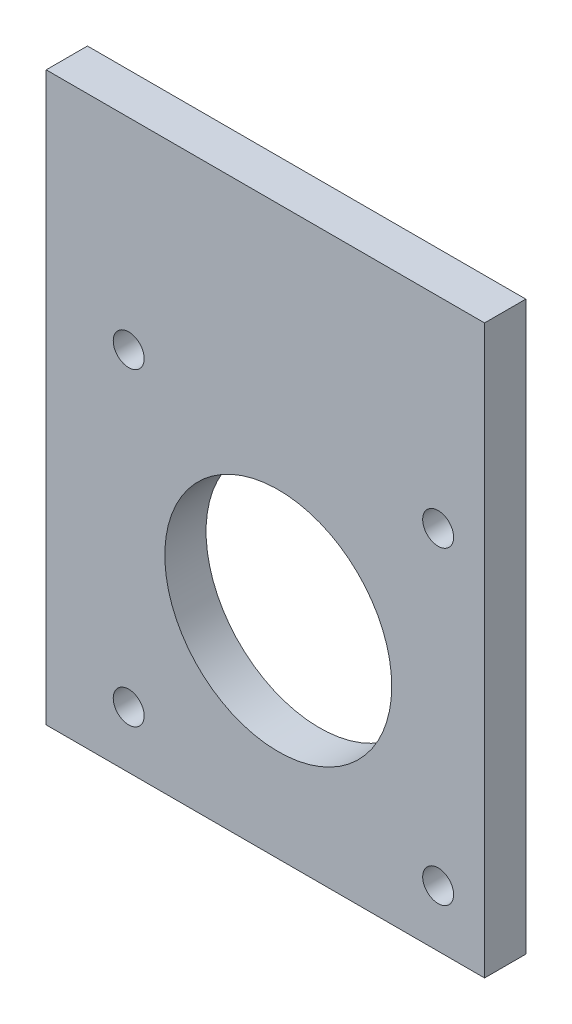
ISO-10303-21;
HEADER;
FILE_DESCRIPTION(('STEP AP214'),'2;1');
FILE_NAME('part.step','',(''),(''),'','','');
FILE_SCHEMA(('AUTOMOTIVE_DESIGN { 1 0 10303 214 1 1 1 1 }'));
ENDSEC;
DATA;
#1=APPLICATION_CONTEXT('core data for automotive mechanical design processes');
#2=APPLICATION_PROTOCOL_DEFINITION('international standard','automotive_design',2000,#1);
#3=PRODUCT_CONTEXT('',#1,'mechanical');
#4=PRODUCT('Part','Part','',(#3));
#5=PRODUCT_RELATED_PRODUCT_CATEGORY('part','',(#4));
#6=PRODUCT_DEFINITION_FORMATION('','',#4);
#7=PRODUCT_DEFINITION_CONTEXT('part definition',#1,'design');
#8=PRODUCT_DEFINITION('design','',#6,#7);
#9=PRODUCT_DEFINITION_SHAPE('','',#8);
#10=(LENGTH_UNIT() NAMED_UNIT(*) SI_UNIT(.MILLI.,.METRE.));
#11=(NAMED_UNIT(*) PLANE_ANGLE_UNIT() SI_UNIT($,.RADIAN.));
#12=(NAMED_UNIT(*) SI_UNIT($,.STERADIAN.) SOLID_ANGLE_UNIT());
#13=UNCERTAINTY_MEASURE_WITH_UNIT(LENGTH_MEASURE(1.E-05),#10,'distance_accuracy_value','');
#14=(GEOMETRIC_REPRESENTATION_CONTEXT(3) GLOBAL_UNCERTAINTY_ASSIGNED_CONTEXT((#13)) GLOBAL_UNIT_ASSIGNED_CONTEXT((#10,
#11,#12)) REPRESENTATION_CONTEXT('',''));
#15=CARTESIAN_POINT('',(0.,0.,0.));
#16=DIRECTION('',(0.,0.,1.));
#17=DIRECTION('',(1.,0.,0.));
#18=AXIS2_PLACEMENT_3D('',#15,#16,#17);
#19=CARTESIAN_POINT('',(21.25,20.,2.));
#20=DIRECTION('',(-1.,0.,0.));
#21=DIRECTION('',(0.,0.,1.));
#22=AXIS2_PLACEMENT_3D('',#19,#20,#21);
#23=PLANE('',#22);
#24=DIRECTION('',(0.,1.,0.));
#25=VECTOR('',#24,1.);
#26=CARTESIAN_POINT('',(21.25,20.,-2.));
#27=LINE('',#26,#25);
#28=CARTESIAN_POINT('',(21.25,-20.,-2.));
#29=VERTEX_POINT('',#28);
#30=CARTESIAN_POINT('',(21.25,35.,-2.));
#31=VERTEX_POINT('',#30);
#32=EDGE_CURVE('E130',#29,#31,#27,.T.);
#33=ORIENTED_EDGE('',*,*,#32,.T.);
#34=DIRECTION('',(0.,0.,-1.));
#35=VECTOR('',#34,1.);
#36=CARTESIAN_POINT('',(21.25,35.,-2.));
#37=LINE('',#36,#35);
#38=CARTESIAN_POINT('',(21.25,35.,2.));
#39=VERTEX_POINT('',#38);
#40=EDGE_CURVE('E94',#39,#31,#37,.T.);
#41=ORIENTED_EDGE('',*,*,#40,.F.);
#42=DIRECTION('',(0.,1.,0.));
#43=VECTOR('',#42,1.);
#44=CARTESIAN_POINT('',(21.25,20.,2.));
#45=LINE('',#44,#43);
#46=CARTESIAN_POINT('',(21.25,-20.,2.));
#47=VERTEX_POINT('',#46);
#48=EDGE_CURVE('E85',#47,#39,#45,.T.);
#49=ORIENTED_EDGE('',*,*,#48,.F.);
#50=DIRECTION('',(0.,0.,-1.));
#51=VECTOR('',#50,1.);
#52=CARTESIAN_POINT('',(21.25,-20.,2.));
#53=LINE('',#52,#51);
#54=EDGE_CURVE('E47',#47,#29,#53,.T.);
#55=ORIENTED_EDGE('',*,*,#54,.T.);
#56=EDGE_LOOP('',(#33,#41,#49,#55));
#57=FACE_BOUND('',#56,.T.);
#58=ADVANCED_FACE('F39',(#57),#23,.F.);
#59=CARTESIAN_POINT('',(-21.25,20.,2.));
#60=DIRECTION('',(1.,0.,0.));
#61=DIRECTION('',(0.,1.,0.));
#62=AXIS2_PLACEMENT_3D('',#59,#60,#61);
#63=PLANE('',#62);
#64=DIRECTION('',(0.,-1.,0.));
#65=VECTOR('',#64,1.);
#66=CARTESIAN_POINT('',(-21.25,20.,-2.));
#67=LINE('',#66,#65);
#68=CARTESIAN_POINT('',(-21.25,35.,-2.));
#69=VERTEX_POINT('',#68);
#70=CARTESIAN_POINT('',(-21.25,-20.,-2.));
#71=VERTEX_POINT('',#70);
#72=EDGE_CURVE('E66',#69,#71,#67,.T.);
#73=ORIENTED_EDGE('',*,*,#72,.T.);
#74=DIRECTION('',(0.,0.,-1.));
#75=VECTOR('',#74,1.);
#76=CARTESIAN_POINT('',(-21.25,-20.,2.));
#77=LINE('',#76,#75);
#78=CARTESIAN_POINT('',(-21.25,-20.,2.));
#79=VERTEX_POINT('',#78);
#80=EDGE_CURVE('E11',#79,#71,#77,.T.);
#81=ORIENTED_EDGE('',*,*,#80,.F.);
#82=DIRECTION('',(0.,-1.,0.));
#83=VECTOR('',#82,1.);
#84=CARTESIAN_POINT('',(-21.25,20.,2.));
#85=LINE('',#84,#83);
#86=CARTESIAN_POINT('',(-21.25,35.,2.));
#87=VERTEX_POINT('',#86);
#88=EDGE_CURVE('E80',#87,#79,#85,.T.);
#89=ORIENTED_EDGE('',*,*,#88,.F.);
#90=DIRECTION('',(0.,0.,1.));
#91=VECTOR('',#90,1.);
#92=CARTESIAN_POINT('',(-21.25,35.,-2.));
#93=LINE('',#92,#91);
#94=EDGE_CURVE('E84',#69,#87,#93,.T.);
#95=ORIENTED_EDGE('',*,*,#94,.F.);
#96=EDGE_LOOP('',(#73,#81,#89,#95));
#97=FACE_BOUND('',#96,.T.);
#98=ADVANCED_FACE('F82',(#97),#63,.F.);
#99=CARTESIAN_POINT('',(-21.25,-20.,2.));
#100=DIRECTION('',(0.,1.,0.));
#101=DIRECTION('',(0.,0.,1.));
#102=AXIS2_PLACEMENT_3D('',#99,#100,#101);
#103=PLANE('',#102);
#104=DIRECTION('',(1.,0.,0.));
#105=VECTOR('',#104,1.);
#106=CARTESIAN_POINT('',(-21.25,-20.,-2.));
#107=LINE('',#106,#105);
#108=EDGE_CURVE('E133',#71,#29,#107,.T.);
#109=ORIENTED_EDGE('',*,*,#108,.T.);
#110=ORIENTED_EDGE('',*,*,#54,.F.);
#111=DIRECTION('',(1.,0.,0.));
#112=VECTOR('',#111,1.);
#113=CARTESIAN_POINT('',(-21.25,-20.,2.));
#114=LINE('',#113,#112);
#115=EDGE_CURVE('E55',#79,#47,#114,.T.);
#116=ORIENTED_EDGE('',*,*,#115,.F.);
#117=ORIENTED_EDGE('',*,*,#80,.T.);
#118=EDGE_LOOP('',(#109,#110,#116,#117));
#119=FACE_BOUND('',#118,.T.);
#120=ADVANCED_FACE('F143',(#119),#103,.F.);
#121=CARTESIAN_POINT('',(0.,0.,2.));
#122=DIRECTION('',(0.,0.,1.));
#123=DIRECTION('',(1.,0.,0.));
#124=AXIS2_PLACEMENT_3D('',#121,#122,#123);
#125=PLANE('',#124);
#126=CARTESIAN_POINT('',(1.24999999999999,0.,2.));
#127=DIRECTION('',(0.,0.,1.));
#128=DIRECTION('',(1.,0.,0.));
#129=AXIS2_PLACEMENT_3D('',#126,#127,#128);
#130=CIRCLE('',#129,11.);
#131=CARTESIAN_POINT('',(12.25,0.,2.));
#132=VERTEX_POINT('',#131);
#133=EDGE_CURVE('E102',#132,#132,#130,.T.);
#134=ORIENTED_EDGE('',*,*,#133,.F.);
#135=EDGE_LOOP('',(#134));
#136=FACE_BOUND('',#135,.T.);
#137=CARTESIAN_POINT('',(16.7500000000003,-14.5,2.));
#138=DIRECTION('',(0.,0.,-1.));
#139=DIRECTION('',(-1.,0.,0.));
#140=AXIS2_PLACEMENT_3D('',#137,#138,#139);
#141=CIRCLE('',#140,1.49999999999999);
#142=CARTESIAN_POINT('',(15.2500000000003,-14.5,2.));
#143=VERTEX_POINT('',#142);
#144=EDGE_CURVE('E122',#143,#143,#141,.T.);
#145=ORIENTED_EDGE('',*,*,#144,.T.);
#146=EDGE_LOOP('',(#145));
#147=FACE_BOUND('',#146,.T.);
#148=CARTESIAN_POINT('',(-13.2499999999997,-14.5,2.));
#149=DIRECTION('',(0.,0.,-1.));
#150=DIRECTION('',(-1.,0.,0.));
#151=AXIS2_PLACEMENT_3D('',#148,#149,#150);
#152=CIRCLE('',#151,1.49999999999999);
#153=CARTESIAN_POINT('',(-14.7499999999997,-14.5,2.));
#154=VERTEX_POINT('',#153);
#155=EDGE_CURVE('E116',#154,#154,#152,.T.);
#156=ORIENTED_EDGE('',*,*,#155,.T.);
#157=EDGE_LOOP('',(#156));
#158=FACE_BOUND('',#157,.T.);
#159=CARTESIAN_POINT('',(-13.25,15.5,2.));
#160=DIRECTION('',(0.,0.,-1.));
#161=DIRECTION('',(-1.,0.,0.));
#162=AXIS2_PLACEMENT_3D('',#159,#160,#161);
#163=CIRCLE('',#162,1.49999999999999);
#164=CARTESIAN_POINT('',(-14.75,15.5,2.));
#165=VERTEX_POINT('',#164);
#166=EDGE_CURVE('E109',#165,#165,#163,.T.);
#167=ORIENTED_EDGE('',*,*,#166,.T.);
#168=EDGE_LOOP('',(#167));
#169=FACE_BOUND('',#168,.T.);
#170=CARTESIAN_POINT('',(16.75,15.5,2.));
#171=DIRECTION('',(0.,0.,-1.));
#172=DIRECTION('',(-1.,0.,0.));
#173=AXIS2_PLACEMENT_3D('',#170,#171,#172);
#174=CIRCLE('',#173,1.49999999999999);
#175=CARTESIAN_POINT('',(15.25,15.5,2.));
#176=VERTEX_POINT('',#175);
#177=EDGE_CURVE('E127',#176,#176,#174,.T.);
#178=ORIENTED_EDGE('',*,*,#177,.T.);
#179=EDGE_LOOP('',(#178));
#180=FACE_BOUND('',#179,.T.);
#181=ORIENTED_EDGE('',*,*,#48,.T.);
#182=DIRECTION('',(1.,0.,0.));
#183=VECTOR('',#182,1.);
#184=CARTESIAN_POINT('',(-21.25,35.,2.));
#185=LINE('',#184,#183);
#186=EDGE_CURVE('E88',#87,#39,#185,.T.);
#187=ORIENTED_EDGE('',*,*,#186,.F.);
#188=ORIENTED_EDGE('',*,*,#88,.T.);
#189=ORIENTED_EDGE('',*,*,#115,.T.);
#190=EDGE_LOOP('',(#181,#187,#188,#189));
#191=FACE_BOUND('',#190,.T.);
#192=ADVANCED_FACE('F89',(#136,#147,#158,#169,#180,#191),#125,.T.);
#193=CARTESIAN_POINT('',(0.,0.,-2.));
#194=DIRECTION('',(0.,0.,1.));
#195=DIRECTION('',(1.,0.,0.));
#196=AXIS2_PLACEMENT_3D('',#193,#194,#195);
#197=PLANE('',#196);
#198=CARTESIAN_POINT('',(1.24999999999999,0.,-2.));
#199=DIRECTION('',(0.,0.,1.));
#200=DIRECTION('',(1.,0.,0.));
#201=AXIS2_PLACEMENT_3D('',#198,#199,#200);
#202=CIRCLE('',#201,11.);
#203=CARTESIAN_POINT('',(12.25,0.,-2.));
#204=VERTEX_POINT('',#203);
#205=EDGE_CURVE('E103',#204,#204,#202,.T.);
#206=ORIENTED_EDGE('',*,*,#205,.T.);
#207=EDGE_LOOP('',(#206));
#208=FACE_BOUND('',#207,.T.);
#209=CARTESIAN_POINT('',(16.7500000000003,-14.5,-2.));
#210=DIRECTION('',(0.,0.,-1.));
#211=DIRECTION('',(-1.,0.,0.));
#212=AXIS2_PLACEMENT_3D('',#209,#210,#211);
#213=CIRCLE('',#212,1.49999999999999);
#214=CARTESIAN_POINT('',(15.2500000000003,-14.5,-2.));
#215=VERTEX_POINT('',#214);
#216=EDGE_CURVE('E106',#215,#215,#213,.T.);
#217=ORIENTED_EDGE('',*,*,#216,.F.);
#218=EDGE_LOOP('',(#217));
#219=FACE_BOUND('',#218,.T.);
#220=CARTESIAN_POINT('',(-13.2499999999997,-14.5,-2.));
#221=DIRECTION('',(0.,0.,-1.));
#222=DIRECTION('',(-1.,0.,0.));
#223=AXIS2_PLACEMENT_3D('',#220,#221,#222);
#224=CIRCLE('',#223,1.49999999999999);
#225=CARTESIAN_POINT('',(-14.7499999999997,-14.5,-2.));
#226=VERTEX_POINT('',#225);
#227=EDGE_CURVE('E119',#226,#226,#224,.T.);
#228=ORIENTED_EDGE('',*,*,#227,.F.);
#229=EDGE_LOOP('',(#228));
#230=FACE_BOUND('',#229,.T.);
#231=CARTESIAN_POINT('',(-13.25,15.5,-2.));
#232=DIRECTION('',(0.,0.,-1.));
#233=DIRECTION('',(-1.,0.,0.));
#234=AXIS2_PLACEMENT_3D('',#231,#232,#233);
#235=CIRCLE('',#234,1.49999999999999);
#236=CARTESIAN_POINT('',(-14.75,15.5,-2.));
#237=VERTEX_POINT('',#236);
#238=EDGE_CURVE('E113',#237,#237,#235,.T.);
#239=ORIENTED_EDGE('',*,*,#238,.F.);
#240=EDGE_LOOP('',(#239));
#241=FACE_BOUND('',#240,.T.);
#242=CARTESIAN_POINT('',(16.75,15.5,-2.));
#243=DIRECTION('',(0.,0.,-1.));
#244=DIRECTION('',(-1.,0.,0.));
#245=AXIS2_PLACEMENT_3D('',#242,#243,#244);
#246=CIRCLE('',#245,1.49999999999999);
#247=CARTESIAN_POINT('',(15.25,15.5,-2.));
#248=VERTEX_POINT('',#247);
#249=EDGE_CURVE('E112',#248,#248,#246,.T.);
#250=ORIENTED_EDGE('',*,*,#249,.F.);
#251=EDGE_LOOP('',(#250));
#252=FACE_BOUND('',#251,.T.);
#253=ORIENTED_EDGE('',*,*,#32,.F.);
#254=ORIENTED_EDGE('',*,*,#108,.F.);
#255=ORIENTED_EDGE('',*,*,#72,.F.);
#256=DIRECTION('',(-1.,0.,0.));
#257=VECTOR('',#256,1.);
#258=CARTESIAN_POINT('',(-21.25,35.,-2.));
#259=LINE('',#258,#257);
#260=EDGE_CURVE('E97',#31,#69,#259,.T.);
#261=ORIENTED_EDGE('',*,*,#260,.F.);
#262=EDGE_LOOP('',(#253,#254,#255,#261));
#263=FACE_BOUND('',#262,.T.);
#264=ADVANCED_FACE('F142',(#208,#219,#230,#241,#252,#263),#197,.F.);
#265=CARTESIAN_POINT('',(16.75,15.5,2.));
#266=DIRECTION('',(0.,0.,-1.));
#267=DIRECTION('',(-1.,0.,0.));
#268=AXIS2_PLACEMENT_3D('',#265,#266,#267);
#269=CYLINDRICAL_SURFACE('',#268,1.49999999999999);
#270=ORIENTED_EDGE('',*,*,#177,.F.);
#271=EDGE_LOOP('',(#270));
#272=FACE_BOUND('',#271,.T.);
#273=ORIENTED_EDGE('',*,*,#249,.T.);
#274=EDGE_LOOP('',(#273));
#275=FACE_BOUND('',#274,.T.);
#276=ADVANCED_FACE('F178',(#272,#275),#269,.F.);
#277=CARTESIAN_POINT('',(-13.25,15.5,2.));
#278=DIRECTION('',(0.,0.,-1.));
#279=DIRECTION('',(-1.,0.,0.));
#280=AXIS2_PLACEMENT_3D('',#277,#278,#279);
#281=CYLINDRICAL_SURFACE('',#280,1.49999999999999);
#282=ORIENTED_EDGE('',*,*,#166,.F.);
#283=EDGE_LOOP('',(#282));
#284=FACE_BOUND('',#283,.T.);
#285=ORIENTED_EDGE('',*,*,#238,.T.);
#286=EDGE_LOOP('',(#285));
#287=FACE_BOUND('',#286,.T.);
#288=ADVANCED_FACE('F212',(#284,#287),#281,.F.);
#289=CARTESIAN_POINT('',(-13.2499999999997,-14.5,2.));
#290=DIRECTION('',(0.,0.,-1.));
#291=DIRECTION('',(-1.,0.,0.));
#292=AXIS2_PLACEMENT_3D('',#289,#290,#291);
#293=CYLINDRICAL_SURFACE('',#292,1.49999999999999);
#294=ORIENTED_EDGE('',*,*,#155,.F.);
#295=EDGE_LOOP('',(#294));
#296=FACE_BOUND('',#295,.T.);
#297=ORIENTED_EDGE('',*,*,#227,.T.);
#298=EDGE_LOOP('',(#297));
#299=FACE_BOUND('',#298,.T.);
#300=ADVANCED_FACE('F204',(#296,#299),#293,.F.);
#301=CARTESIAN_POINT('',(16.7500000000003,-14.5,2.));
#302=DIRECTION('',(0.,0.,-1.));
#303=DIRECTION('',(-1.,0.,0.));
#304=AXIS2_PLACEMENT_3D('',#301,#302,#303);
#305=CYLINDRICAL_SURFACE('',#304,1.49999999999999);
#306=ORIENTED_EDGE('',*,*,#144,.F.);
#307=EDGE_LOOP('',(#306));
#308=FACE_BOUND('',#307,.T.);
#309=ORIENTED_EDGE('',*,*,#216,.T.);
#310=EDGE_LOOP('',(#309));
#311=FACE_BOUND('',#310,.T.);
#312=ADVANCED_FACE('F196',(#308,#311),#305,.F.);
#313=CARTESIAN_POINT('',(1.24999999999999,0.,-2.));
#314=DIRECTION('',(0.,0.,1.));
#315=DIRECTION('',(1.,0.,0.));
#316=AXIS2_PLACEMENT_3D('',#313,#314,#315);
#317=CYLINDRICAL_SURFACE('',#316,11.);
#318=ORIENTED_EDGE('',*,*,#205,.F.);
#319=EDGE_LOOP('',(#318));
#320=FACE_BOUND('',#319,.T.);
#321=ORIENTED_EDGE('',*,*,#133,.T.);
#322=EDGE_LOOP('',(#321));
#323=FACE_BOUND('',#322,.T.);
#324=ADVANCED_FACE('F188',(#320,#323),#317,.F.);
#325=CARTESIAN_POINT('',(0.,35.,0.));
#326=DIRECTION('',(0.,1.,0.));
#327=DIRECTION('',(0.,0.,1.));
#328=AXIS2_PLACEMENT_3D('',#325,#326,#327);
#329=PLANE('',#328);
#330=ORIENTED_EDGE('',*,*,#94,.T.);
#331=ORIENTED_EDGE('',*,*,#186,.T.);
#332=ORIENTED_EDGE('',*,*,#40,.T.);
#333=ORIENTED_EDGE('',*,*,#260,.T.);
#334=EDGE_LOOP('',(#330,#331,#332,#333));
#335=FACE_BOUND('',#334,.T.);
#336=ADVANCED_FACE('F96',(#335),#329,.T.);
#337=CLOSED_SHELL('',(#58,#98,#120,#192,#264,#276,#288,#300,#312,#324,#336));
#338=MANIFOLD_SOLID_BREP('B2',#337);
#339=ADVANCED_BREP_SHAPE_REPRESENTATION('',(#18,#338),#14);
#340=SHAPE_DEFINITION_REPRESENTATION(#9,#339);
ENDSEC;
END-ISO-10303-21;
